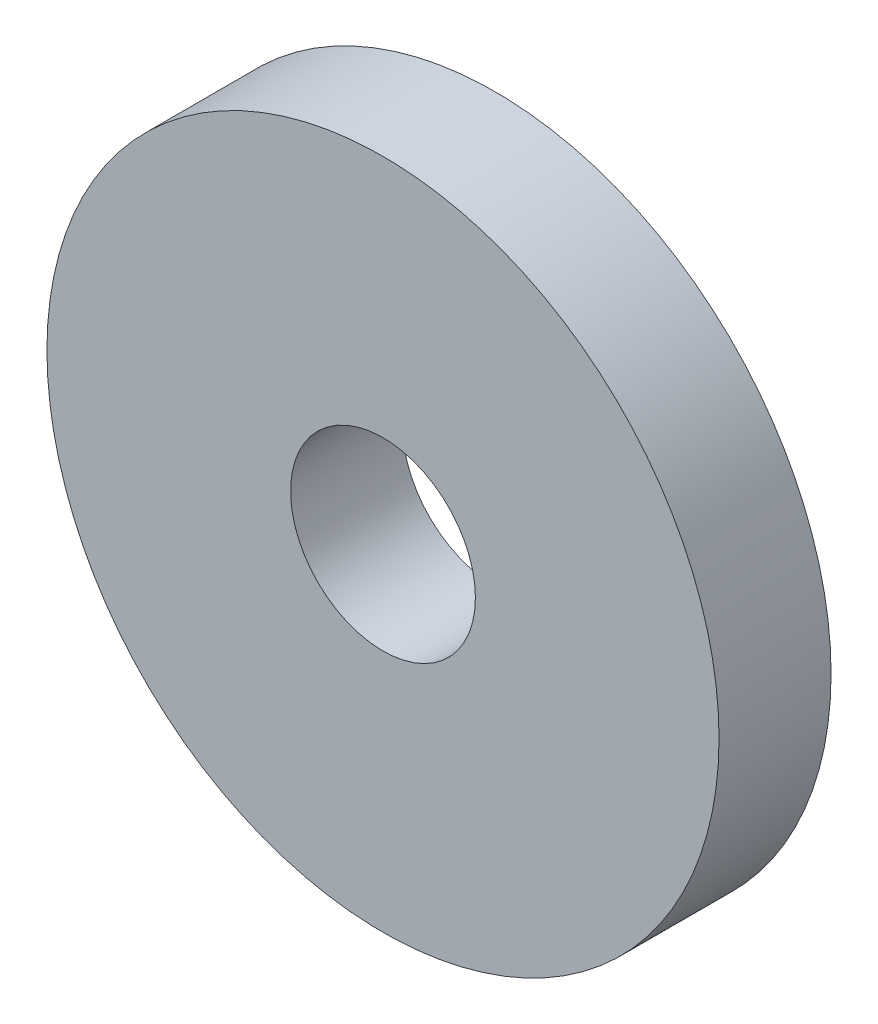
ISO-10303-21;
HEADER;
FILE_DESCRIPTION(('STEP AP214'),'2;1');
FILE_NAME('part.step','',(''),(''),'','','');
FILE_SCHEMA(('AUTOMOTIVE_DESIGN { 1 0 10303 214 1 1 1 1 }'));
ENDSEC;
DATA;
#1=APPLICATION_CONTEXT('core data for automotive mechanical design processes');
#2=APPLICATION_PROTOCOL_DEFINITION('international standard','automotive_design',2000,#1);
#3=PRODUCT_CONTEXT('',#1,'mechanical');
#4=PRODUCT('Part','Part','',(#3));
#5=PRODUCT_RELATED_PRODUCT_CATEGORY('part','',(#4));
#6=PRODUCT_DEFINITION_FORMATION('','',#4);
#7=PRODUCT_DEFINITION_CONTEXT('part definition',#1,'design');
#8=PRODUCT_DEFINITION('design','',#6,#7);
#9=PRODUCT_DEFINITION_SHAPE('','',#8);
#10=(LENGTH_UNIT() NAMED_UNIT(*) SI_UNIT(.MILLI.,.METRE.));
#11=(NAMED_UNIT(*) PLANE_ANGLE_UNIT() SI_UNIT($,.RADIAN.));
#12=(NAMED_UNIT(*) SI_UNIT($,.STERADIAN.) SOLID_ANGLE_UNIT());
#13=UNCERTAINTY_MEASURE_WITH_UNIT(LENGTH_MEASURE(1.E-05),#10,'distance_accuracy_value','');
#14=(GEOMETRIC_REPRESENTATION_CONTEXT(3) GLOBAL_UNCERTAINTY_ASSIGNED_CONTEXT((#13)) GLOBAL_UNIT_ASSIGNED_CONTEXT((#10,
#11,#12)) REPRESENTATION_CONTEXT('',''));
#15=CARTESIAN_POINT('',(0.,0.,0.));
#16=DIRECTION('',(0.,0.,1.));
#17=DIRECTION('',(1.,0.,0.));
#18=AXIS2_PLACEMENT_3D('',#15,#16,#17);
#19=CARTESIAN_POINT('',(0.,0.,2.));
#20=DIRECTION('',(0.,0.,1.));
#21=DIRECTION('',(1.,0.,0.));
#22=AXIS2_PLACEMENT_3D('',#19,#20,#21);
#23=PLANE('',#22);
#24=CARTESIAN_POINT('',(0.,0.,2.));
#25=DIRECTION('',(0.,0.,1.));
#26=DIRECTION('',(1.,0.,0.));
#27=AXIS2_PLACEMENT_3D('',#24,#25,#26);
#28=CIRCLE('',#27,12.);
#29=CARTESIAN_POINT('',(12.,0.,2.));
#30=VERTEX_POINT('',#29);
#31=EDGE_CURVE('E10',#30,#30,#28,.T.);
#32=ORIENTED_EDGE('',*,*,#31,.T.);
#33=EDGE_LOOP('',(#32));
#34=FACE_BOUND('',#33,.T.);
#35=CARTESIAN_POINT('',(0.,0.,2.));
#36=DIRECTION('',(0.,0.,1.));
#37=DIRECTION('',(1.,0.,0.));
#38=AXIS2_PLACEMENT_3D('',#35,#36,#37);
#39=CIRCLE('',#38,3.3);
#40=CARTESIAN_POINT('',(3.3,0.,2.));
#41=VERTEX_POINT('',#40);
#42=EDGE_CURVE('E54',#41,#41,#39,.T.);
#43=ORIENTED_EDGE('',*,*,#42,.F.);
#44=EDGE_LOOP('',(#43));
#45=FACE_BOUND('',#44,.T.);
#46=ADVANCED_FACE('F41',(#34,#45),#23,.T.);
#47=CARTESIAN_POINT('',(0.,0.,-2.));
#48=DIRECTION('',(0.,0.,1.));
#49=DIRECTION('',(1.,0.,0.));
#50=AXIS2_PLACEMENT_3D('',#47,#48,#49);
#51=PLANE('',#50);
#52=CARTESIAN_POINT('',(0.,0.,-2.));
#53=DIRECTION('',(0.,0.,1.));
#54=DIRECTION('',(1.,0.,0.));
#55=AXIS2_PLACEMENT_3D('',#52,#53,#54);
#56=CIRCLE('',#55,12.);
#57=CARTESIAN_POINT('',(12.,0.,-2.));
#58=VERTEX_POINT('',#57);
#59=EDGE_CURVE('E45',#58,#58,#56,.T.);
#60=ORIENTED_EDGE('',*,*,#59,.F.);
#61=EDGE_LOOP('',(#60));
#62=FACE_BOUND('',#61,.T.);
#63=CARTESIAN_POINT('',(0.,0.,-2.));
#64=DIRECTION('',(0.,0.,1.));
#65=DIRECTION('',(1.,0.,0.));
#66=AXIS2_PLACEMENT_3D('',#63,#64,#65);
#67=CIRCLE('',#66,3.3);
#68=CARTESIAN_POINT('',(3.3,0.,-2.));
#69=VERTEX_POINT('',#68);
#70=EDGE_CURVE('E56',#69,#69,#67,.T.);
#71=ORIENTED_EDGE('',*,*,#70,.T.);
#72=EDGE_LOOP('',(#71));
#73=FACE_BOUND('',#72,.T.);
#74=ADVANCED_FACE('F68',(#62,#73),#51,.F.);
#75=CARTESIAN_POINT('',(0.,0.,2.));
#76=DIRECTION('',(0.,0.,-1.));
#77=DIRECTION('',(-1.,0.,0.));
#78=AXIS2_PLACEMENT_3D('',#75,#76,#77);
#79=CYLINDRICAL_SURFACE('',#78,12.);
#80=ORIENTED_EDGE('',*,*,#31,.F.);
#81=EDGE_LOOP('',(#80));
#82=FACE_BOUND('',#81,.T.);
#83=ORIENTED_EDGE('',*,*,#59,.T.);
#84=EDGE_LOOP('',(#83));
#85=FACE_BOUND('',#84,.T.);
#86=ADVANCED_FACE('F43',(#82,#85),#79,.T.);
#87=CARTESIAN_POINT('',(0.,0.,2.));
#88=DIRECTION('',(0.,0.,-1.));
#89=DIRECTION('',(-1.,0.,0.));
#90=AXIS2_PLACEMENT_3D('',#87,#88,#89);
#91=CYLINDRICAL_SURFACE('',#90,3.3);
#92=ORIENTED_EDGE('',*,*,#42,.T.);
#93=EDGE_LOOP('',(#92));
#94=FACE_BOUND('',#93,.T.);
#95=ORIENTED_EDGE('',*,*,#70,.F.);
#96=EDGE_LOOP('',(#95));
#97=FACE_BOUND('',#96,.T.);
#98=ADVANCED_FACE('F64',(#94,#97),#91,.F.);
#99=CLOSED_SHELL('',(#46,#74,#86,#98));
#100=MANIFOLD_SOLID_BREP('B2',#99);
#101=ADVANCED_BREP_SHAPE_REPRESENTATION('',(#18,#100),#14);
#102=SHAPE_DEFINITION_REPRESENTATION(#9,#101);
ENDSEC;
END-ISO-10303-21;
